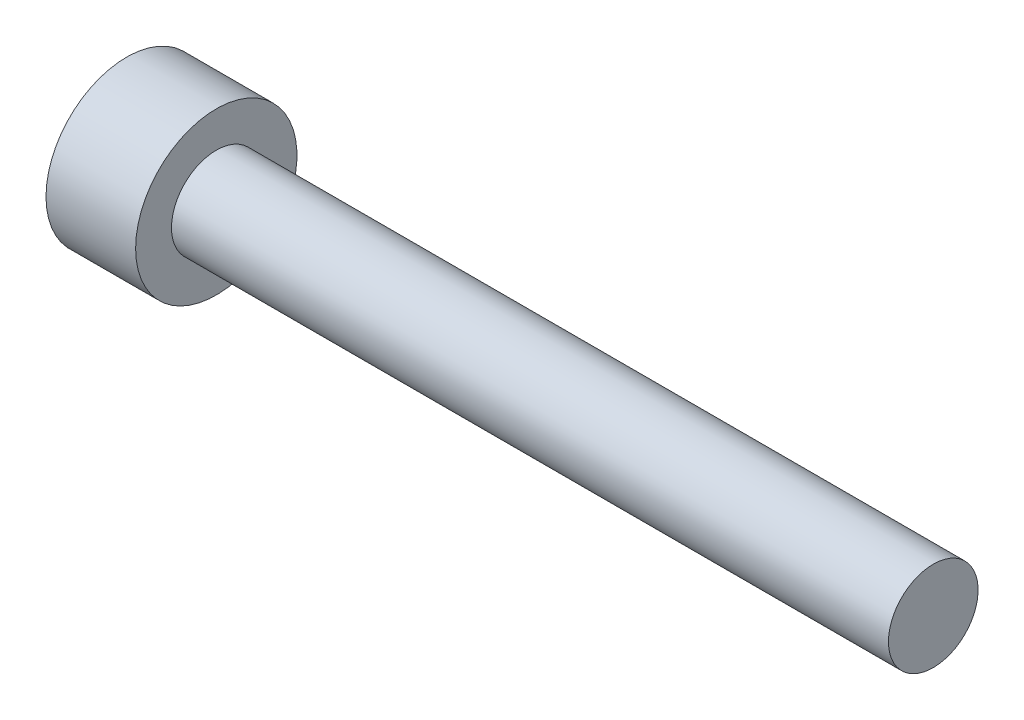
ISO-10303-21;
HEADER;
FILE_DESCRIPTION(('STEP AP214'),'2;1');
FILE_NAME('part.step','',(''),(''),'','','');
FILE_SCHEMA(('AUTOMOTIVE_DESIGN { 1 0 10303 214 1 1 1 1 }'));
ENDSEC;
DATA;
#1=APPLICATION_CONTEXT('core data for automotive mechanical design processes');
#2=APPLICATION_PROTOCOL_DEFINITION('international standard','automotive_design',2000,#1);
#3=PRODUCT_CONTEXT('',#1,'mechanical');
#4=PRODUCT('Part','Part','',(#3));
#5=PRODUCT_RELATED_PRODUCT_CATEGORY('part','',(#4));
#6=PRODUCT_DEFINITION_FORMATION('','',#4);
#7=PRODUCT_DEFINITION_CONTEXT('part definition',#1,'design');
#8=PRODUCT_DEFINITION('design','',#6,#7);
#9=PRODUCT_DEFINITION_SHAPE('','',#8);
#10=(LENGTH_UNIT() NAMED_UNIT(*) SI_UNIT(.MILLI.,.METRE.));
#11=(NAMED_UNIT(*) PLANE_ANGLE_UNIT() SI_UNIT($,.RADIAN.));
#12=(NAMED_UNIT(*) SI_UNIT($,.STERADIAN.) SOLID_ANGLE_UNIT());
#13=UNCERTAINTY_MEASURE_WITH_UNIT(LENGTH_MEASURE(1.E-05),#10,'distance_accuracy_value','');
#14=(GEOMETRIC_REPRESENTATION_CONTEXT(3) GLOBAL_UNCERTAINTY_ASSIGNED_CONTEXT((#13)) GLOBAL_UNIT_ASSIGNED_CONTEXT((#10,
#11,#12)) REPRESENTATION_CONTEXT('',''));
#15=CARTESIAN_POINT('',(0.,0.,0.));
#16=DIRECTION('',(0.,0.,1.));
#17=DIRECTION('',(1.,0.,0.));
#18=AXIS2_PLACEMENT_3D('',#15,#16,#17);
#19=CARTESIAN_POINT('',(-2.5,0.,0.));
#20=DIRECTION('',(1.,0.,0.));
#21=DIRECTION('',(0.,0.,-1.));
#22=AXIS2_PLACEMENT_3D('',#19,#20,#21);
#23=PLANE('',#22);
#24=CARTESIAN_POINT('',(-2.5,0.,0.));
#25=DIRECTION('',(-1.,0.,0.));
#26=DIRECTION('',(0.,0.,1.));
#27=AXIS2_PLACEMENT_3D('',#24,#25,#26);
#28=CIRCLE('',#27,2.25);
#29=CARTESIAN_POINT('',(-2.5,0.,2.25));
#30=VERTEX_POINT('',#29);
#31=EDGE_CURVE('E11',#30,#30,#28,.T.);
#32=ORIENTED_EDGE('',*,*,#31,.T.);
#33=EDGE_LOOP('',(#32));
#34=FACE_BOUND('',#33,.T.);
#35=DIRECTION('',(0.,0.866025403784439,-0.5));
#36=VECTOR('',#35,1.);
#37=CARTESIAN_POINT('',(-2.5,-1.,-0.577350269189626));
#38=LINE('',#37,#36);
#39=CARTESIAN_POINT('',(-2.5,-1.,-0.577350269189626));
#40=VERTEX_POINT('',#39);
#41=CARTESIAN_POINT('',(-2.5,0.,-1.15470053837925));
#42=VERTEX_POINT('',#41);
#43=EDGE_CURVE('E54',#40,#42,#38,.T.);
#44=ORIENTED_EDGE('',*,*,#43,.T.);
#45=DIRECTION('',(0.,0.866025403784439,0.5));
#46=VECTOR('',#45,1.);
#47=CARTESIAN_POINT('',(-2.5,0.,-1.15470053837925));
#48=LINE('',#47,#46);
#49=CARTESIAN_POINT('',(-2.5,1.,-0.577350269189626));
#50=VERTEX_POINT('',#49);
#51=EDGE_CURVE('E127',#42,#50,#48,.T.);
#52=ORIENTED_EDGE('',*,*,#51,.T.);
#53=DIRECTION('',(0.,0.,1.));
#54=VECTOR('',#53,1.);
#55=CARTESIAN_POINT('',(-2.5,1.,-0.577350269189626));
#56=LINE('',#55,#54);
#57=CARTESIAN_POINT('',(-2.5,1.,0.577350269189626));
#58=VERTEX_POINT('',#57);
#59=EDGE_CURVE('E129',#50,#58,#56,.T.);
#60=ORIENTED_EDGE('',*,*,#59,.T.);
#61=DIRECTION('',(0.,-0.866025403784438,0.5));
#62=VECTOR('',#61,1.);
#63=CARTESIAN_POINT('',(-2.5,1.,0.577350269189626));
#64=LINE('',#63,#62);
#65=CARTESIAN_POINT('',(-2.5,0.,1.15470053837925));
#66=VERTEX_POINT('',#65);
#67=EDGE_CURVE('E135',#58,#66,#64,.T.);
#68=ORIENTED_EDGE('',*,*,#67,.T.);
#69=DIRECTION('',(0.,-0.866025403784439,-0.5));
#70=VECTOR('',#69,1.);
#71=CARTESIAN_POINT('',(-2.5,0.,1.15470053837925));
#72=LINE('',#71,#70);
#73=CARTESIAN_POINT('',(-2.5,-1.,0.577350269189626));
#74=VERTEX_POINT('',#73);
#75=EDGE_CURVE('E116',#66,#74,#72,.T.);
#76=ORIENTED_EDGE('',*,*,#75,.T.);
#77=DIRECTION('',(0.,0.,-1.));
#78=VECTOR('',#77,1.);
#79=CARTESIAN_POINT('',(-2.5,-1.,0.577350269189626));
#80=LINE('',#79,#78);
#81=EDGE_CURVE('E134',#74,#40,#80,.T.);
#82=ORIENTED_EDGE('',*,*,#81,.T.);
#83=EDGE_LOOP('',(#44,#52,#60,#68,#76,#82));
#84=FACE_BOUND('',#83,.T.);
#85=ADVANCED_FACE('F41',(#34,#84),#23,.F.);
#86=CARTESIAN_POINT('',(-400.,0.,0.));
#87=DIRECTION('',(-1.,0.,0.));
#88=DIRECTION('',(0.,0.,1.));
#89=AXIS2_PLACEMENT_3D('',#86,#87,#88);
#90=CYLINDRICAL_SURFACE('',#89,2.25);
#91=ORIENTED_EDGE('',*,*,#31,.F.);
#92=EDGE_LOOP('',(#91));
#93=FACE_BOUND('',#92,.T.);
#94=CARTESIAN_POINT('',(0.,0.,0.));
#95=DIRECTION('',(-1.,0.,0.));
#96=DIRECTION('',(0.,0.,1.));
#97=AXIS2_PLACEMENT_3D('',#94,#95,#96);
#98=CIRCLE('',#97,2.25);
#99=CARTESIAN_POINT('',(0.,0.,2.25));
#100=VERTEX_POINT('',#99);
#101=EDGE_CURVE('E48',#100,#100,#98,.T.);
#102=ORIENTED_EDGE('',*,*,#101,.T.);
#103=EDGE_LOOP('',(#102));
#104=FACE_BOUND('',#103,.T.);
#105=ADVANCED_FACE('F152',(#93,#104),#90,.T.);
#106=CARTESIAN_POINT('',(0.,2.25,0.));
#107=DIRECTION('',(-1.,0.,0.));
#108=DIRECTION('',(0.,0.,1.));
#109=AXIS2_PLACEMENT_3D('',#106,#107,#108);
#110=PLANE('',#109);
#111=ORIENTED_EDGE('',*,*,#101,.F.);
#112=EDGE_LOOP('',(#111));
#113=FACE_BOUND('',#112,.T.);
#114=CARTESIAN_POINT('',(0.,0.,0.));
#115=DIRECTION('',(-1.,0.,0.));
#116=DIRECTION('',(0.,0.,1.));
#117=AXIS2_PLACEMENT_3D('',#114,#115,#116);
#118=CIRCLE('',#117,1.25);
#119=CARTESIAN_POINT('',(0.,0.,1.25));
#120=VERTEX_POINT('',#119);
#121=EDGE_CURVE('E149',#120,#120,#118,.T.);
#122=ORIENTED_EDGE('',*,*,#121,.T.);
#123=EDGE_LOOP('',(#122));
#124=FACE_BOUND('',#123,.T.);
#125=ADVANCED_FACE('F156',(#113,#124),#110,.F.);
#126=CARTESIAN_POINT('',(-400.,0.,0.));
#127=DIRECTION('',(-1.,0.,0.));
#128=DIRECTION('',(0.,0.,1.));
#129=AXIS2_PLACEMENT_3D('',#126,#127,#128);
#130=CYLINDRICAL_SURFACE('',#129,1.25);
#131=ORIENTED_EDGE('',*,*,#121,.F.);
#132=EDGE_LOOP('',(#131));
#133=FACE_BOUND('',#132,.T.);
#134=CARTESIAN_POINT('',(20.,0.,0.));
#135=DIRECTION('',(-1.,0.,0.));
#136=DIRECTION('',(0.,0.,1.));
#137=AXIS2_PLACEMENT_3D('',#134,#135,#136);
#138=CIRCLE('',#137,1.25);
#139=CARTESIAN_POINT('',(20.,0.,1.25));
#140=VERTEX_POINT('',#139);
#141=EDGE_CURVE('E148',#140,#140,#138,.T.);
#142=ORIENTED_EDGE('',*,*,#141,.T.);
#143=EDGE_LOOP('',(#142));
#144=FACE_BOUND('',#143,.T.);
#145=ADVANCED_FACE('F157',(#133,#144),#130,.T.);
#146=CARTESIAN_POINT('',(20.,1.25,0.));
#147=DIRECTION('',(-1.,0.,0.));
#148=DIRECTION('',(0.,0.,1.));
#149=AXIS2_PLACEMENT_3D('',#146,#147,#148);
#150=PLANE('',#149);
#151=ORIENTED_EDGE('',*,*,#141,.F.);
#152=EDGE_LOOP('',(#151));
#153=FACE_BOUND('',#152,.T.);
#154=ADVANCED_FACE('F164',(#153),#150,.F.);
#155=CARTESIAN_POINT('',(-1.25,-1.,-0.577350269189626));
#156=DIRECTION('',(0.,0.5,0.866025403784439));
#157=DIRECTION('',(0.,-0.866025403784439,0.5));
#158=AXIS2_PLACEMENT_3D('',#155,#156,#157);
#159=PLANE('',#158);
#160=ORIENTED_EDGE('',*,*,#43,.F.);
#161=DIRECTION('',(-1.,0.,0.));
#162=VECTOR('',#161,1.);
#163=CARTESIAN_POINT('',(-1.25,-1.,-0.577350269189626));
#164=LINE('',#163,#162);
#165=CARTESIAN_POINT('',(-1.25,-1.,-0.577350269189626));
#166=VERTEX_POINT('',#165);
#167=EDGE_CURVE('E121',#166,#40,#164,.T.);
#168=ORIENTED_EDGE('',*,*,#167,.F.);
#169=DIRECTION('',(0.,0.866025403784439,-0.5));
#170=VECTOR('',#169,1.);
#171=CARTESIAN_POINT('',(-1.25,-1.,-0.577350269189626));
#172=LINE('',#171,#170);
#173=CARTESIAN_POINT('',(-1.25,0.,-1.15470053837925));
#174=VERTEX_POINT('',#173);
#175=EDGE_CURVE('E137',#166,#174,#172,.T.);
#176=ORIENTED_EDGE('',*,*,#175,.T.);
#177=DIRECTION('',(-1.,0.,0.));
#178=VECTOR('',#177,1.);
#179=CARTESIAN_POINT('',(-1.25,0.,-1.15470053837925));
#180=LINE('',#179,#178);
#181=EDGE_CURVE('E145',#174,#42,#180,.T.);
#182=ORIENTED_EDGE('',*,*,#181,.T.);
#183=EDGE_LOOP('',(#160,#168,#176,#182));
#184=FACE_BOUND('',#183,.T.);
#185=ADVANCED_FACE('F168',(#184),#159,.T.);
#186=CARTESIAN_POINT('',(-1.25,0.,-1.15470053837925));
#187=DIRECTION('',(0.,-0.5,0.866025403784439));
#188=DIRECTION('',(0.,-0.866025403784439,-0.5));
#189=AXIS2_PLACEMENT_3D('',#186,#187,#188);
#190=PLANE('',#189);
#191=ORIENTED_EDGE('',*,*,#51,.F.);
#192=ORIENTED_EDGE('',*,*,#181,.F.);
#193=DIRECTION('',(0.,0.866025403784439,0.5));
#194=VECTOR('',#193,1.);
#195=CARTESIAN_POINT('',(-1.25,0.,-1.15470053837925));
#196=LINE('',#195,#194);
#197=CARTESIAN_POINT('',(-1.25,1.,-0.577350269189626));
#198=VERTEX_POINT('',#197);
#199=EDGE_CURVE('E94',#174,#198,#196,.T.);
#200=ORIENTED_EDGE('',*,*,#199,.T.);
#201=DIRECTION('',(-1.,0.,0.));
#202=VECTOR('',#201,1.);
#203=CARTESIAN_POINT('',(-1.25,1.,-0.577350269189626));
#204=LINE('',#203,#202);
#205=EDGE_CURVE('E142',#198,#50,#204,.T.);
#206=ORIENTED_EDGE('',*,*,#205,.T.);
#207=EDGE_LOOP('',(#191,#192,#200,#206));
#208=FACE_BOUND('',#207,.T.);
#209=ADVANCED_FACE('F176',(#208),#190,.T.);
#210=CARTESIAN_POINT('',(-1.25,1.,-0.577350269189626));
#211=DIRECTION('',(0.,-1.,0.));
#212=DIRECTION('',(0.,0.,-1.));
#213=AXIS2_PLACEMENT_3D('',#210,#211,#212);
#214=PLANE('',#213);
#215=ORIENTED_EDGE('',*,*,#59,.F.);
#216=ORIENTED_EDGE('',*,*,#205,.F.);
#217=DIRECTION('',(0.,0.,1.));
#218=VECTOR('',#217,1.);
#219=CARTESIAN_POINT('',(-1.25,1.,-0.577350269189626));
#220=LINE('',#219,#218);
#221=CARTESIAN_POINT('',(-1.25,1.,0.577350269189626));
#222=VERTEX_POINT('',#221);
#223=EDGE_CURVE('E115',#198,#222,#220,.T.);
#224=ORIENTED_EDGE('',*,*,#223,.T.);
#225=DIRECTION('',(-1.,0.,0.));
#226=VECTOR('',#225,1.);
#227=CARTESIAN_POINT('',(-1.25,1.,0.577350269189626));
#228=LINE('',#227,#226);
#229=EDGE_CURVE('E108',#222,#58,#228,.T.);
#230=ORIENTED_EDGE('',*,*,#229,.T.);
#231=EDGE_LOOP('',(#215,#216,#224,#230));
#232=FACE_BOUND('',#231,.T.);
#233=ADVANCED_FACE('F195',(#232),#214,.T.);
#234=CARTESIAN_POINT('',(-1.25,1.,0.577350269189626));
#235=DIRECTION('',(0.,-0.5,-0.866025403784439));
#236=DIRECTION('',(0.,0.866025403784439,-0.5));
#237=AXIS2_PLACEMENT_3D('',#234,#235,#236);
#238=PLANE('',#237);
#239=ORIENTED_EDGE('',*,*,#67,.F.);
#240=ORIENTED_EDGE('',*,*,#229,.F.);
#241=DIRECTION('',(0.,-0.866025403784438,0.5));
#242=VECTOR('',#241,1.);
#243=CARTESIAN_POINT('',(-1.25,1.,0.577350269189626));
#244=LINE('',#243,#242);
#245=CARTESIAN_POINT('',(-1.25,0.,1.15470053837925));
#246=VERTEX_POINT('',#245);
#247=EDGE_CURVE('E102',#222,#246,#244,.T.);
#248=ORIENTED_EDGE('',*,*,#247,.T.);
#249=DIRECTION('',(-1.,0.,0.));
#250=VECTOR('',#249,1.);
#251=CARTESIAN_POINT('',(-1.25,0.,1.15470053837925));
#252=LINE('',#251,#250);
#253=EDGE_CURVE('E107',#246,#66,#252,.T.);
#254=ORIENTED_EDGE('',*,*,#253,.T.);
#255=EDGE_LOOP('',(#239,#240,#248,#254));
#256=FACE_BOUND('',#255,.T.);
#257=ADVANCED_FACE('F110',(#256),#238,.T.);
#258=CARTESIAN_POINT('',(-1.25,0.,1.15470053837925));
#259=DIRECTION('',(0.,0.5,-0.866025403784439));
#260=DIRECTION('',(0.,0.866025403784439,0.5));
#261=AXIS2_PLACEMENT_3D('',#258,#259,#260);
#262=PLANE('',#261);
#263=ORIENTED_EDGE('',*,*,#75,.F.);
#264=ORIENTED_EDGE('',*,*,#253,.F.);
#265=DIRECTION('',(0.,-0.866025403784439,-0.5));
#266=VECTOR('',#265,1.);
#267=CARTESIAN_POINT('',(-1.25,0.,1.15470053837925));
#268=LINE('',#267,#266);
#269=CARTESIAN_POINT('',(-1.25,-1.,0.577350269189626));
#270=VERTEX_POINT('',#269);
#271=EDGE_CURVE('E112',#246,#270,#268,.T.);
#272=ORIENTED_EDGE('',*,*,#271,.T.);
#273=DIRECTION('',(-1.,0.,0.));
#274=VECTOR('',#273,1.);
#275=CARTESIAN_POINT('',(-1.25,-1.,0.577350269189626));
#276=LINE('',#275,#274);
#277=EDGE_CURVE('E84',#270,#74,#276,.T.);
#278=ORIENTED_EDGE('',*,*,#277,.T.);
#279=EDGE_LOOP('',(#263,#264,#272,#278));
#280=FACE_BOUND('',#279,.T.);
#281=ADVANCED_FACE('F111',(#280),#262,.T.);
#282=CARTESIAN_POINT('',(-1.25,-1.,0.577350269189626));
#283=DIRECTION('',(0.,1.,0.));
#284=DIRECTION('',(0.,0.,1.));
#285=AXIS2_PLACEMENT_3D('',#282,#283,#284);
#286=PLANE('',#285);
#287=ORIENTED_EDGE('',*,*,#81,.F.);
#288=ORIENTED_EDGE('',*,*,#277,.F.);
#289=DIRECTION('',(0.,0.,-1.));
#290=VECTOR('',#289,1.);
#291=CARTESIAN_POINT('',(-1.25,-1.,0.577350269189626));
#292=LINE('',#291,#290);
#293=EDGE_CURVE('E62',#270,#166,#292,.T.);
#294=ORIENTED_EDGE('',*,*,#293,.T.);
#295=ORIENTED_EDGE('',*,*,#167,.T.);
#296=EDGE_LOOP('',(#287,#288,#294,#295));
#297=FACE_BOUND('',#296,.T.);
#298=ADVANCED_FACE('F183',(#297),#286,.T.);
#299=CARTESIAN_POINT('',(-1.25,0.,0.));
#300=DIRECTION('',(1.,0.,0.));
#301=DIRECTION('',(0.,0.,-1.));
#302=AXIS2_PLACEMENT_3D('',#299,#300,#301);
#303=PLANE('',#302);
#304=ORIENTED_EDGE('',*,*,#175,.F.);
#305=ORIENTED_EDGE('',*,*,#293,.F.);
#306=ORIENTED_EDGE('',*,*,#271,.F.);
#307=ORIENTED_EDGE('',*,*,#247,.F.);
#308=ORIENTED_EDGE('',*,*,#223,.F.);
#309=ORIENTED_EDGE('',*,*,#199,.F.);
#310=EDGE_LOOP('',(#304,#305,#306,#307,#308,#309));
#311=FACE_BOUND('',#310,.T.);
#312=ADVANCED_FACE('F118',(#311),#303,.F.);
#313=CLOSED_SHELL('',(#85,#105,#125,#145,#154,#185,#209,#233,#257,#281,#298,#312));
#314=MANIFOLD_SOLID_BREP('B2',#313);
#315=ADVANCED_BREP_SHAPE_REPRESENTATION('',(#18,#314),#14);
#316=SHAPE_DEFINITION_REPRESENTATION(#9,#315);
ENDSEC;
END-ISO-10303-21;
